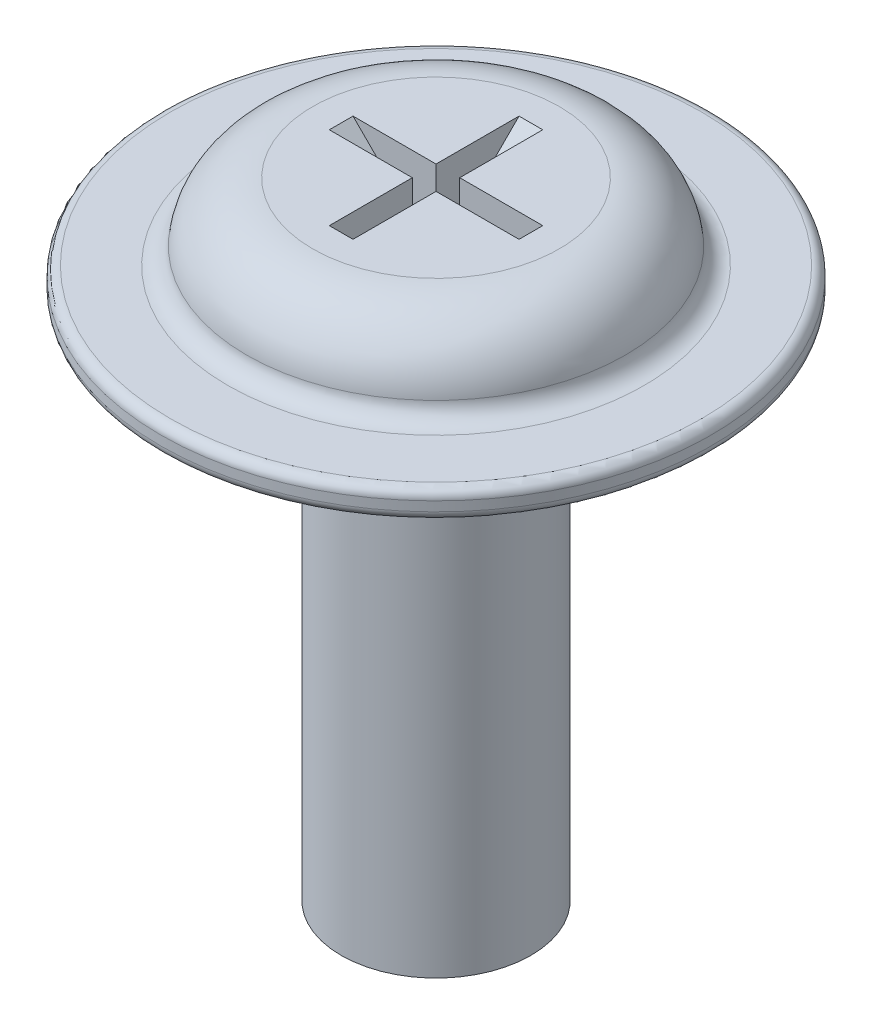
ISO-10303-21;
HEADER;
FILE_DESCRIPTION(('STEP AP214'),'2;1');
FILE_NAME('part.step','',(''),(''),'','','');
FILE_SCHEMA(('AUTOMOTIVE_DESIGN { 1 0 10303 214 1 1 1 1 }'));
ENDSEC;
DATA;
#1=APPLICATION_CONTEXT('core data for automotive mechanical design processes');
#2=APPLICATION_PROTOCOL_DEFINITION('international standard','automotive_design',2000,#1);
#3=PRODUCT_CONTEXT('',#1,'mechanical');
#4=PRODUCT('Part','Part','',(#3));
#5=PRODUCT_RELATED_PRODUCT_CATEGORY('part','',(#4));
#6=PRODUCT_DEFINITION_FORMATION('','',#4);
#7=PRODUCT_DEFINITION_CONTEXT('part definition',#1,'design');
#8=PRODUCT_DEFINITION('design','',#6,#7);
#9=PRODUCT_DEFINITION_SHAPE('','',#8);
#10=(LENGTH_UNIT() NAMED_UNIT(*) SI_UNIT(.MILLI.,.METRE.));
#11=(NAMED_UNIT(*) PLANE_ANGLE_UNIT() SI_UNIT($,.RADIAN.));
#12=(NAMED_UNIT(*) SI_UNIT($,.STERADIAN.) SOLID_ANGLE_UNIT());
#13=UNCERTAINTY_MEASURE_WITH_UNIT(LENGTH_MEASURE(1.E-05),#10,'distance_accuracy_value','');
#14=(GEOMETRIC_REPRESENTATION_CONTEXT(3) GLOBAL_UNCERTAINTY_ASSIGNED_CONTEXT((#13)) GLOBAL_UNIT_ASSIGNED_CONTEXT((#10,
#11,#12)) REPRESENTATION_CONTEXT('',''));
#15=CARTESIAN_POINT('',(0.,0.,0.));
#16=DIRECTION('',(0.,0.,1.));
#17=DIRECTION('',(1.,0.,0.));
#18=AXIS2_PLACEMENT_3D('',#15,#16,#17);
#19=CARTESIAN_POINT('',(0.,0.3,0.));
#20=DIRECTION('',(0.,-1.,0.));
#21=DIRECTION('',(0.,0.,-1.));
#22=AXIS2_PLACEMENT_3D('',#19,#20,#21);
#23=CYLINDRICAL_SURFACE('',#22,2.9);
#24=CARTESIAN_POINT('',(0.,0.1,0.));
#25=DIRECTION('',(0.,1.,0.));
#26=DIRECTION('',(0.,0.,1.));
#27=AXIS2_PLACEMENT_3D('',#24,#25,#26);
#28=CIRCLE('',#27,2.9);
#29=CARTESIAN_POINT('',(0.,0.1,2.9));
#30=VERTEX_POINT('',#29);
#31=EDGE_CURVE('E296',#30,#30,#28,.T.);
#32=ORIENTED_EDGE('',*,*,#31,.T.);
#33=EDGE_LOOP('',(#32));
#34=FACE_BOUND('',#33,.T.);
#35=CARTESIAN_POINT('',(0.,0.2,0.));
#36=DIRECTION('',(0.,1.,0.));
#37=DIRECTION('',(0.,0.,1.));
#38=AXIS2_PLACEMENT_3D('',#35,#36,#37);
#39=CIRCLE('',#38,2.9);
#40=CARTESIAN_POINT('',(0.,0.2,2.9));
#41=VERTEX_POINT('',#40);
#42=EDGE_CURVE('E251',#41,#41,#39,.F.);
#43=ORIENTED_EDGE('',*,*,#42,.T.);
#44=EDGE_LOOP('',(#43));
#45=FACE_BOUND('',#44,.T.);
#46=ADVANCED_FACE('F50',(#34,#45),#23,.T.);
#47=CARTESIAN_POINT('',(0.,0.3,0.));
#48=DIRECTION('',(0.,1.,0.));
#49=DIRECTION('',(0.,0.,1.));
#50=AXIS2_PLACEMENT_3D('',#47,#48,#49);
#51=PLANE('',#50);
#52=CARTESIAN_POINT('',(0.,0.3,0.));
#53=DIRECTION('',(0.,1.,0.));
#54=DIRECTION('',(0.,0.,1.));
#55=AXIS2_PLACEMENT_3D('',#52,#53,#54);
#56=CIRCLE('',#55,2.19442719099992);
#57=CARTESIAN_POINT('',(0.,0.3,2.19442719099992));
#58=VERTEX_POINT('',#57);
#59=EDGE_CURVE('E297',#58,#58,#56,.F.);
#60=ORIENTED_EDGE('',*,*,#59,.T.);
#61=EDGE_LOOP('',(#60));
#62=FACE_BOUND('',#61,.T.);
#63=CARTESIAN_POINT('',(0.,0.3,0.));
#64=DIRECTION('',(0.,1.,0.));
#65=DIRECTION('',(0.,0.,1.));
#66=AXIS2_PLACEMENT_3D('',#63,#64,#65);
#67=CIRCLE('',#66,2.8);
#68=CARTESIAN_POINT('',(0.,0.3,2.8));
#69=VERTEX_POINT('',#68);
#70=EDGE_CURVE('E248',#69,#69,#67,.T.);
#71=ORIENTED_EDGE('',*,*,#70,.T.);
#72=EDGE_LOOP('',(#71));
#73=FACE_BOUND('',#72,.T.);
#74=ADVANCED_FACE('F324',(#62,#73),#51,.T.);
#75=CARTESIAN_POINT('',(0.,0.,0.));
#76=DIRECTION('',(0.,1.,0.));
#77=DIRECTION('',(0.,0.,1.));
#78=AXIS2_PLACEMENT_3D('',#75,#76,#77);
#79=PLANE('',#78);
#80=CARTESIAN_POINT('',(0.,0.,0.));
#81=DIRECTION('',(0.,1.,0.));
#82=DIRECTION('',(0.,0.,1.));
#83=AXIS2_PLACEMENT_3D('',#80,#81,#82);
#84=CIRCLE('',#83,1.1);
#85=CARTESIAN_POINT('',(0.,0.,1.1));
#86=VERTEX_POINT('',#85);
#87=EDGE_CURVE('E11',#86,#86,#84,.T.);
#88=ORIENTED_EDGE('',*,*,#87,.T.);
#89=EDGE_LOOP('',(#88));
#90=FACE_BOUND('',#89,.T.);
#91=CARTESIAN_POINT('',(0.,0.,0.));
#92=DIRECTION('',(0.,1.,0.));
#93=DIRECTION('',(0.,0.,1.));
#94=AXIS2_PLACEMENT_3D('',#91,#92,#93);
#95=CIRCLE('',#94,2.8);
#96=CARTESIAN_POINT('',(0.,0.,2.8));
#97=VERTEX_POINT('',#96);
#98=EDGE_CURVE('E303',#97,#97,#95,.F.);
#99=ORIENTED_EDGE('',*,*,#98,.T.);
#100=EDGE_LOOP('',(#99));
#101=FACE_BOUND('',#100,.T.);
#102=ADVANCED_FACE('F335',(#90,#101),#79,.F.);
#103=CARTESIAN_POINT('',(0.,0.2,0.));
#104=DIRECTION('',(0.,1.,0.));
#105=DIRECTION('',(0.,0.,1.));
#106=AXIS2_PLACEMENT_3D('',#103,#104,#105);
#107=TOROIDAL_SURFACE('',#106,2.8,0.1);
#108=ORIENTED_EDGE('',*,*,#42,.F.);
#109=EDGE_LOOP('',(#108));
#110=FACE_BOUND('',#109,.T.);
#111=ORIENTED_EDGE('',*,*,#70,.F.);
#112=EDGE_LOOP('',(#111));
#113=FACE_BOUND('',#112,.T.);
#114=ADVANCED_FACE('F338',(#110,#113),#107,.T.);
#115=CARTESIAN_POINT('',(0.,0.400000000000001,0.));
#116=DIRECTION('',(0.,1.,0.));
#117=DIRECTION('',(0.,0.,1.));
#118=AXIS2_PLACEMENT_3D('',#115,#116,#117);
#119=TOROIDAL_SURFACE('',#118,1.3,0.7);
#120=CARTESIAN_POINT('',(0.,0.477777777777778,0.));
#121=DIRECTION('',(0.,-1.,0.));
#122=DIRECTION('',(0.,0.,-1.));
#123=AXIS2_PLACEMENT_3D('',#120,#121,#122);
#124=CIRCLE('',#123,1.99566559299994);
#125=CARTESIAN_POINT('',(0.,0.477777777777778,-1.99566559299994));
#126=VERTEX_POINT('',#125);
#127=EDGE_CURVE('E295',#126,#126,#124,.F.);
#128=ORIENTED_EDGE('',*,*,#127,.T.);
#129=EDGE_LOOP('',(#128));
#130=FACE_BOUND('',#129,.T.);
#131=CARTESIAN_POINT('',(0.,1.1,0.));
#132=DIRECTION('',(0.,1.,0.));
#133=DIRECTION('',(0.,0.,1.));
#134=AXIS2_PLACEMENT_3D('',#131,#132,#133);
#135=CIRCLE('',#134,1.3);
#136=CARTESIAN_POINT('',(0.,1.1,1.3));
#137=VERTEX_POINT('',#136);
#138=EDGE_CURVE('E241',#137,#137,#135,.T.);
#139=ORIENTED_EDGE('',*,*,#138,.F.);
#140=EDGE_LOOP('',(#139));
#141=FACE_BOUND('',#140,.T.);
#142=ADVANCED_FACE('F341',(#130,#141),#119,.T.);
#143=CARTESIAN_POINT('',(0.,1.1,0.));
#144=DIRECTION('',(0.,-1.,0.));
#145=DIRECTION('',(0.,0.,-1.));
#146=AXIS2_PLACEMENT_3D('',#143,#144,#145);
#147=PLANE('',#146);
#148=DIRECTION('',(1.,0.,0.));
#149=VECTOR('',#148,1.);
#150=CARTESIAN_POINT('',(-0.125,1.1,0.125));
#151=LINE('',#150,#149);
#152=CARTESIAN_POINT('',(-1.,1.1,0.125));
#153=VERTEX_POINT('',#152);
#154=CARTESIAN_POINT('',(-0.125,1.1,0.125));
#155=VERTEX_POINT('',#154);
#156=EDGE_CURVE('E63',#153,#155,#151,.T.);
#157=ORIENTED_EDGE('',*,*,#156,.F.);
#158=DIRECTION('',(0.,0.,-1.));
#159=VECTOR('',#158,1.);
#160=CARTESIAN_POINT('',(-1.,1.1,0.));
#161=LINE('',#160,#159);
#162=CARTESIAN_POINT('',(-1.,1.1,-0.125));
#163=VERTEX_POINT('',#162);
#164=EDGE_CURVE('E268',#153,#163,#161,.T.);
#165=ORIENTED_EDGE('',*,*,#164,.T.);
#166=DIRECTION('',(-1.,0.,0.));
#167=VECTOR('',#166,1.);
#168=CARTESIAN_POINT('',(-0.125,1.1,-0.125));
#169=LINE('',#168,#167);
#170=CARTESIAN_POINT('',(-0.125,1.1,-0.125));
#171=VERTEX_POINT('',#170);
#172=EDGE_CURVE('E72',#171,#163,#169,.T.);
#173=ORIENTED_EDGE('',*,*,#172,.F.);
#174=DIRECTION('',(0.,0.,1.));
#175=VECTOR('',#174,1.);
#176=CARTESIAN_POINT('',(-0.125,1.1,-0.5));
#177=LINE('',#176,#175);
#178=CARTESIAN_POINT('',(-0.125,1.1,-1.));
#179=VERTEX_POINT('',#178);
#180=EDGE_CURVE('E216',#179,#171,#177,.T.);
#181=ORIENTED_EDGE('',*,*,#180,.F.);
#182=DIRECTION('',(1.,0.,0.));
#183=VECTOR('',#182,1.);
#184=CARTESIAN_POINT('',(0.,1.1,-1.));
#185=LINE('',#184,#183);
#186=CARTESIAN_POINT('',(0.125,1.1,-1.));
#187=VERTEX_POINT('',#186);
#188=EDGE_CURVE('E260',#179,#187,#185,.T.);
#189=ORIENTED_EDGE('',*,*,#188,.T.);
#190=DIRECTION('',(0.,0.,-1.));
#191=VECTOR('',#190,1.);
#192=CARTESIAN_POINT('',(0.125,1.1,-0.5));
#193=LINE('',#192,#191);
#194=CARTESIAN_POINT('',(0.125,1.1,-0.125));
#195=VERTEX_POINT('',#194);
#196=EDGE_CURVE('E213',#195,#187,#193,.T.);
#197=ORIENTED_EDGE('',*,*,#196,.F.);
#198=DIRECTION('',(-1.,0.,0.));
#199=VECTOR('',#198,1.);
#200=CARTESIAN_POINT('',(0.125,1.1,-0.125));
#201=LINE('',#200,#199);
#202=CARTESIAN_POINT('',(1.,1.1,-0.125));
#203=VERTEX_POINT('',#202);
#204=EDGE_CURVE('E207',#203,#195,#201,.T.);
#205=ORIENTED_EDGE('',*,*,#204,.F.);
#206=DIRECTION('',(0.,0.,1.));
#207=VECTOR('',#206,1.);
#208=CARTESIAN_POINT('',(1.,1.1,0.));
#209=LINE('',#208,#207);
#210=CARTESIAN_POINT('',(1.,1.1,0.125));
#211=VERTEX_POINT('',#210);
#212=EDGE_CURVE('E261',#203,#211,#209,.T.);
#213=ORIENTED_EDGE('',*,*,#212,.T.);
#214=DIRECTION('',(1.,0.,0.));
#215=VECTOR('',#214,1.);
#216=CARTESIAN_POINT('',(0.125,1.1,0.125));
#217=LINE('',#216,#215);
#218=CARTESIAN_POINT('',(0.125,1.1,0.125));
#219=VERTEX_POINT('',#218);
#220=EDGE_CURVE('E145',#219,#211,#217,.T.);
#221=ORIENTED_EDGE('',*,*,#220,.F.);
#222=DIRECTION('',(0.,0.,-1.));
#223=VECTOR('',#222,1.);
#224=CARTESIAN_POINT('',(0.125,1.1,0.5));
#225=LINE('',#224,#223);
#226=CARTESIAN_POINT('',(0.125,1.1,1.));
#227=VERTEX_POINT('',#226);
#228=EDGE_CURVE('E165',#227,#219,#225,.T.);
#229=ORIENTED_EDGE('',*,*,#228,.F.);
#230=DIRECTION('',(-1.,0.,0.));
#231=VECTOR('',#230,1.);
#232=CARTESIAN_POINT('',(0.,1.1,1.));
#233=LINE('',#232,#231);
#234=CARTESIAN_POINT('',(-0.125,1.1,1.));
#235=VERTEX_POINT('',#234);
#236=EDGE_CURVE('E262',#227,#235,#233,.T.);
#237=ORIENTED_EDGE('',*,*,#236,.T.);
#238=DIRECTION('',(0.,0.,1.));
#239=VECTOR('',#238,1.);
#240=CARTESIAN_POINT('',(-0.125,1.1,0.5));
#241=LINE('',#240,#239);
#242=EDGE_CURVE('E221',#155,#235,#241,.T.);
#243=ORIENTED_EDGE('',*,*,#242,.F.);
#244=EDGE_LOOP('',(#157,#165,#173,#181,#189,#197,#205,#213,#221,#229,#237,#243));
#245=FACE_BOUND('',#244,.T.);
#246=ORIENTED_EDGE('',*,*,#138,.T.);
#247=EDGE_LOOP('',(#246));
#248=FACE_BOUND('',#247,.T.);
#249=ADVANCED_FACE('F378',(#245,#248),#147,.F.);
#250=CARTESIAN_POINT('',(0.,-5.5,0.));
#251=DIRECTION('',(0.,1.,0.));
#252=DIRECTION('',(0.,0.,1.));
#253=AXIS2_PLACEMENT_3D('',#250,#251,#252);
#254=CYLINDRICAL_SURFACE('',#253,1.);
#255=CARTESIAN_POINT('',(0.,-0.1,0.));
#256=DIRECTION('',(0.,1.,0.));
#257=DIRECTION('',(0.,0.,1.));
#258=AXIS2_PLACEMENT_3D('',#255,#256,#257);
#259=CIRCLE('',#258,1.);
#260=CARTESIAN_POINT('',(0.,-0.1,1.));
#261=VERTEX_POINT('',#260);
#262=EDGE_CURVE('E57',#261,#261,#259,.F.);
#263=ORIENTED_EDGE('',*,*,#262,.T.);
#264=EDGE_LOOP('',(#263));
#265=FACE_BOUND('',#264,.T.);
#266=CARTESIAN_POINT('',(0.,-5.5,0.));
#267=DIRECTION('',(0.,-1.,0.));
#268=DIRECTION('',(0.,0.,-1.));
#269=AXIS2_PLACEMENT_3D('',#266,#267,#268);
#270=CIRCLE('',#269,1.);
#271=CARTESIAN_POINT('',(0.,-5.5,-1.));
#272=VERTEX_POINT('',#271);
#273=EDGE_CURVE('E232',#272,#272,#270,.T.);
#274=ORIENTED_EDGE('',*,*,#273,.F.);
#275=EDGE_LOOP('',(#274));
#276=FACE_BOUND('',#275,.T.);
#277=ADVANCED_FACE('F313',(#265,#276),#254,.T.);
#278=CARTESIAN_POINT('',(0.,-5.5,0.));
#279=DIRECTION('',(0.,-1.,0.));
#280=DIRECTION('',(0.,0.,-1.));
#281=AXIS2_PLACEMENT_3D('',#278,#279,#280);
#282=PLANE('',#281);
#283=ORIENTED_EDGE('',*,*,#273,.T.);
#284=EDGE_LOOP('',(#283));
#285=FACE_BOUND('',#284,.T.);
#286=ADVANCED_FACE('F389',(#285),#282,.T.);
#287=CARTESIAN_POINT('',(0.125,0.6,0.125));
#288=DIRECTION('',(0.,0.,1.));
#289=DIRECTION('',(1.,0.,0.));
#290=AXIS2_PLACEMENT_3D('',#287,#288,#289);
#291=PLANE('',#290);
#292=ORIENTED_EDGE('',*,*,#220,.T.);
#293=DIRECTION('',(0.707106781186549,0.707106781186546,0.));
#294=VECTOR('',#293,1.);
#295=CARTESIAN_POINT('',(0.312499999999999,0.412500000000001,0.125));
#296=LINE('',#295,#294);
#297=CARTESIAN_POINT('',(0.5,0.6,0.125));
#298=VERTEX_POINT('',#297);
#299=EDGE_CURVE('E137',#211,#298,#296,.F.);
#300=ORIENTED_EDGE('',*,*,#299,.T.);
#301=DIRECTION('',(1.,0.,0.));
#302=VECTOR('',#301,1.);
#303=CARTESIAN_POINT('',(0.125,0.6,0.125));
#304=LINE('',#303,#302);
#305=CARTESIAN_POINT('',(0.125,0.6,0.125));
#306=VERTEX_POINT('',#305);
#307=EDGE_CURVE('E143',#306,#298,#304,.T.);
#308=ORIENTED_EDGE('',*,*,#307,.F.);
#309=DIRECTION('',(0.,1.,0.));
#310=VECTOR('',#309,1.);
#311=CARTESIAN_POINT('',(0.125,0.6,0.125));
#312=LINE('',#311,#310);
#313=EDGE_CURVE('E226',#306,#219,#312,.T.);
#314=ORIENTED_EDGE('',*,*,#313,.T.);
#315=EDGE_LOOP('',(#292,#300,#308,#314));
#316=FACE_BOUND('',#315,.T.);
#317=ADVANCED_FACE('F139',(#316),#291,.F.);
#318=CARTESIAN_POINT('',(0.125,0.6,0.5));
#319=DIRECTION('',(1.,0.,0.));
#320=DIRECTION('',(0.,0.,-1.));
#321=AXIS2_PLACEMENT_3D('',#318,#319,#320);
#322=PLANE('',#321);
#323=ORIENTED_EDGE('',*,*,#228,.T.);
#324=ORIENTED_EDGE('',*,*,#313,.F.);
#325=DIRECTION('',(0.,0.,-1.));
#326=VECTOR('',#325,1.);
#327=CARTESIAN_POINT('',(0.125,0.6,0.5));
#328=LINE('',#327,#326);
#329=CARTESIAN_POINT('',(0.125,0.6,0.5));
#330=VERTEX_POINT('',#329);
#331=EDGE_CURVE('E159',#330,#306,#328,.T.);
#332=ORIENTED_EDGE('',*,*,#331,.F.);
#333=DIRECTION('',(0.,-0.707106781186546,-0.707106781186549));
#334=VECTOR('',#333,1.);
#335=CARTESIAN_POINT('',(0.125,0.600000000000001,0.5));
#336=LINE('',#335,#334);
#337=EDGE_CURVE('E280',#330,#227,#336,.F.);
#338=ORIENTED_EDGE('',*,*,#337,.T.);
#339=EDGE_LOOP('',(#323,#324,#332,#338));
#340=FACE_BOUND('',#339,.T.);
#341=ADVANCED_FACE('F394',(#340),#322,.F.);
#342=CARTESIAN_POINT('',(-0.125,0.6,0.5));
#343=DIRECTION('',(-1.,0.,0.));
#344=DIRECTION('',(0.,0.,1.));
#345=AXIS2_PLACEMENT_3D('',#342,#343,#344);
#346=PLANE('',#345);
#347=ORIENTED_EDGE('',*,*,#242,.T.);
#348=DIRECTION('',(0.,0.707106781186546,0.707106781186549));
#349=VECTOR('',#348,1.);
#350=CARTESIAN_POINT('',(-0.125,0.600000000000001,0.5));
#351=LINE('',#350,#349);
#352=CARTESIAN_POINT('',(-0.125,0.6,0.5));
#353=VERTEX_POINT('',#352);
#354=EDGE_CURVE('E282',#235,#353,#351,.F.);
#355=ORIENTED_EDGE('',*,*,#354,.T.);
#356=DIRECTION('',(0.,0.,1.));
#357=VECTOR('',#356,1.);
#358=CARTESIAN_POINT('',(-0.125,0.6,0.5));
#359=LINE('',#358,#357);
#360=CARTESIAN_POINT('',(-0.125,0.6,0.125));
#361=VERTEX_POINT('',#360);
#362=EDGE_CURVE('E197',#361,#353,#359,.T.);
#363=ORIENTED_EDGE('',*,*,#362,.F.);
#364=DIRECTION('',(0.,1.,0.));
#365=VECTOR('',#364,1.);
#366=CARTESIAN_POINT('',(-0.125,0.6,0.125));
#367=LINE('',#366,#365);
#368=EDGE_CURVE('E233',#361,#155,#367,.T.);
#369=ORIENTED_EDGE('',*,*,#368,.T.);
#370=EDGE_LOOP('',(#347,#355,#363,#369));
#371=FACE_BOUND('',#370,.T.);
#372=ADVANCED_FACE('F412',(#371),#346,.F.);
#373=CARTESIAN_POINT('',(-0.125,0.6,0.125));
#374=DIRECTION('',(0.,0.,1.));
#375=DIRECTION('',(1.,0.,0.));
#376=AXIS2_PLACEMENT_3D('',#373,#374,#375);
#377=PLANE('',#376);
#378=ORIENTED_EDGE('',*,*,#156,.T.);
#379=ORIENTED_EDGE('',*,*,#368,.F.);
#380=DIRECTION('',(1.,0.,0.));
#381=VECTOR('',#380,1.);
#382=CARTESIAN_POINT('',(-0.125,0.6,0.125));
#383=LINE('',#382,#381);
#384=CARTESIAN_POINT('',(-0.5,0.6,0.125));
#385=VERTEX_POINT('',#384);
#386=EDGE_CURVE('E192',#385,#361,#383,.T.);
#387=ORIENTED_EDGE('',*,*,#386,.F.);
#388=DIRECTION('',(0.707106781186549,-0.707106781186546,0.));
#389=VECTOR('',#388,1.);
#390=CARTESIAN_POINT('',(-0.312499999999999,0.412500000000001,0.125));
#391=LINE('',#390,#389);
#392=EDGE_CURVE('E271',#385,#153,#391,.F.);
#393=ORIENTED_EDGE('',*,*,#392,.T.);
#394=EDGE_LOOP('',(#378,#379,#387,#393));
#395=FACE_BOUND('',#394,.T.);
#396=ADVANCED_FACE('F406',(#395),#377,.F.);
#397=CARTESIAN_POINT('',(-0.125,0.6,-0.125));
#398=DIRECTION('',(0.,0.,-1.));
#399=DIRECTION('',(-1.,0.,0.));
#400=AXIS2_PLACEMENT_3D('',#397,#398,#399);
#401=PLANE('',#400);
#402=ORIENTED_EDGE('',*,*,#172,.T.);
#403=DIRECTION('',(-0.707106781186549,0.707106781186546,0.));
#404=VECTOR('',#403,1.);
#405=CARTESIAN_POINT('',(-0.312499999999999,0.412500000000001,-0.125));
#406=LINE('',#405,#404);
#407=CARTESIAN_POINT('',(-0.5,0.6,-0.125));
#408=VERTEX_POINT('',#407);
#409=EDGE_CURVE('E273',#163,#408,#406,.F.);
#410=ORIENTED_EDGE('',*,*,#409,.T.);
#411=DIRECTION('',(-1.,0.,0.));
#412=VECTOR('',#411,1.);
#413=CARTESIAN_POINT('',(-0.125,0.6,-0.125));
#414=LINE('',#413,#412);
#415=CARTESIAN_POINT('',(-0.125,0.6,-0.125));
#416=VERTEX_POINT('',#415);
#417=EDGE_CURVE('E183',#416,#408,#414,.T.);
#418=ORIENTED_EDGE('',*,*,#417,.F.);
#419=DIRECTION('',(0.,1.,0.));
#420=VECTOR('',#419,1.);
#421=CARTESIAN_POINT('',(-0.125,0.6,-0.125));
#422=LINE('',#421,#420);
#423=EDGE_CURVE('E240',#416,#171,#422,.T.);
#424=ORIENTED_EDGE('',*,*,#423,.T.);
#425=EDGE_LOOP('',(#402,#410,#418,#424));
#426=FACE_BOUND('',#425,.T.);
#427=ADVANCED_FACE('F407',(#426),#401,.F.);
#428=CARTESIAN_POINT('',(-0.125,0.6,-0.5));
#429=DIRECTION('',(-1.,0.,0.));
#430=DIRECTION('',(0.,0.,1.));
#431=AXIS2_PLACEMENT_3D('',#428,#429,#430);
#432=PLANE('',#431);
#433=ORIENTED_EDGE('',*,*,#180,.T.);
#434=ORIENTED_EDGE('',*,*,#423,.F.);
#435=DIRECTION('',(0.,0.,1.));
#436=VECTOR('',#435,1.);
#437=CARTESIAN_POINT('',(-0.125,0.6,-0.5));
#438=LINE('',#437,#436);
#439=CARTESIAN_POINT('',(-0.125,0.6,-0.5));
#440=VERTEX_POINT('',#439);
#441=EDGE_CURVE('E182',#440,#416,#438,.T.);
#442=ORIENTED_EDGE('',*,*,#441,.F.);
#443=DIRECTION('',(0.,-0.707106781186546,0.707106781186549));
#444=VECTOR('',#443,1.);
#445=CARTESIAN_POINT('',(-0.125,0.600000000000001,-0.5));
#446=LINE('',#445,#444);
#447=EDGE_CURVE('E147',#440,#179,#446,.F.);
#448=ORIENTED_EDGE('',*,*,#447,.T.);
#449=EDGE_LOOP('',(#433,#434,#442,#448));
#450=FACE_BOUND('',#449,.T.);
#451=ADVANCED_FACE('F405',(#450),#432,.F.);
#452=CARTESIAN_POINT('',(0.125,0.6,-0.5));
#453=DIRECTION('',(1.,0.,0.));
#454=DIRECTION('',(0.,0.,-1.));
#455=AXIS2_PLACEMENT_3D('',#452,#453,#454);
#456=PLANE('',#455);
#457=ORIENTED_EDGE('',*,*,#196,.T.);
#458=DIRECTION('',(0.,0.707106781186546,-0.707106781186549));
#459=VECTOR('',#458,1.);
#460=CARTESIAN_POINT('',(0.125,0.600000000000001,-0.5));
#461=LINE('',#460,#459);
#462=CARTESIAN_POINT('',(0.125,0.6,-0.5));
#463=VERTEX_POINT('',#462);
#464=EDGE_CURVE('E288',#187,#463,#461,.F.);
#465=ORIENTED_EDGE('',*,*,#464,.T.);
#466=DIRECTION('',(0.,0.,-1.));
#467=VECTOR('',#466,1.);
#468=CARTESIAN_POINT('',(0.125,0.6,-0.5));
#469=LINE('',#468,#467);
#470=CARTESIAN_POINT('',(0.125,0.6,-0.125));
#471=VERTEX_POINT('',#470);
#472=EDGE_CURVE('E172',#471,#463,#469,.T.);
#473=ORIENTED_EDGE('',*,*,#472,.F.);
#474=DIRECTION('',(0.,1.,0.));
#475=VECTOR('',#474,1.);
#476=CARTESIAN_POINT('',(0.125,0.6,-0.125));
#477=LINE('',#476,#475);
#478=EDGE_CURVE('E206',#471,#195,#477,.T.);
#479=ORIENTED_EDGE('',*,*,#478,.T.);
#480=EDGE_LOOP('',(#457,#465,#473,#479));
#481=FACE_BOUND('',#480,.T.);
#482=ADVANCED_FACE('F397',(#481),#456,.F.);
#483=CARTESIAN_POINT('',(0.125,0.6,-0.125));
#484=DIRECTION('',(0.,0.,-1.));
#485=DIRECTION('',(-1.,0.,0.));
#486=AXIS2_PLACEMENT_3D('',#483,#484,#485);
#487=PLANE('',#486);
#488=ORIENTED_EDGE('',*,*,#204,.T.);
#489=ORIENTED_EDGE('',*,*,#478,.F.);
#490=DIRECTION('',(-1.,0.,0.));
#491=VECTOR('',#490,1.);
#492=CARTESIAN_POINT('',(0.125,0.6,-0.125));
#493=LINE('',#492,#491);
#494=CARTESIAN_POINT('',(0.5,0.6,-0.125));
#495=VERTEX_POINT('',#494);
#496=EDGE_CURVE('E169',#495,#471,#493,.T.);
#497=ORIENTED_EDGE('',*,*,#496,.F.);
#498=DIRECTION('',(-0.707106781186549,-0.707106781186546,0.));
#499=VECTOR('',#498,1.);
#500=CARTESIAN_POINT('',(0.312499999999999,0.412500000000001,-0.125));
#501=LINE('',#500,#499);
#502=EDGE_CURVE('E151',#495,#203,#501,.F.);
#503=ORIENTED_EDGE('',*,*,#502,.T.);
#504=EDGE_LOOP('',(#488,#489,#497,#503));
#505=FACE_BOUND('',#504,.T.);
#506=ADVANCED_FACE('F391',(#505),#487,.F.);
#507=CARTESIAN_POINT('',(0.,0.6,0.));
#508=DIRECTION('',(0.,-1.,0.));
#509=DIRECTION('',(0.,0.,-1.));
#510=AXIS2_PLACEMENT_3D('',#507,#508,#509);
#511=PLANE('',#510);
#512=ORIENTED_EDGE('',*,*,#307,.T.);
#513=DIRECTION('',(0.,0.,-1.));
#514=VECTOR('',#513,1.);
#515=CARTESIAN_POINT('',(0.5,0.6,-0.125));
#516=LINE('',#515,#514);
#517=EDGE_CURVE('E160',#298,#495,#516,.T.);
#518=ORIENTED_EDGE('',*,*,#517,.T.);
#519=ORIENTED_EDGE('',*,*,#496,.T.);
#520=ORIENTED_EDGE('',*,*,#472,.T.);
#521=DIRECTION('',(-1.,0.,0.));
#522=VECTOR('',#521,1.);
#523=CARTESIAN_POINT('',(-0.125,0.6,-0.5));
#524=LINE('',#523,#522);
#525=EDGE_CURVE('E180',#463,#440,#524,.T.);
#526=ORIENTED_EDGE('',*,*,#525,.T.);
#527=ORIENTED_EDGE('',*,*,#441,.T.);
#528=ORIENTED_EDGE('',*,*,#417,.T.);
#529=DIRECTION('',(0.,0.,1.));
#530=VECTOR('',#529,1.);
#531=CARTESIAN_POINT('',(-0.5,0.6,-0.125));
#532=LINE('',#531,#530);
#533=EDGE_CURVE('E189',#408,#385,#532,.T.);
#534=ORIENTED_EDGE('',*,*,#533,.T.);
#535=ORIENTED_EDGE('',*,*,#386,.T.);
#536=ORIENTED_EDGE('',*,*,#362,.T.);
#537=DIRECTION('',(1.,0.,0.));
#538=VECTOR('',#537,1.);
#539=CARTESIAN_POINT('',(-0.125,0.6,0.5));
#540=LINE('',#539,#538);
#541=EDGE_CURVE('E203',#353,#330,#540,.T.);
#542=ORIENTED_EDGE('',*,*,#541,.T.);
#543=ORIENTED_EDGE('',*,*,#331,.T.);
#544=EDGE_LOOP('',(#512,#518,#519,#520,#526,#527,#528,#534,#535,#536,#542,#543));
#545=FACE_BOUND('',#544,.T.);
#546=ADVANCED_FACE('F154',(#545),#511,.F.);
#547=CARTESIAN_POINT('',(-0.5,0.600000000000001,-0.125));
#548=DIRECTION('',(-0.707106781186546,-0.707106781186549,0.));
#549=DIRECTION('',(0.,0.,1.));
#550=AXIS2_PLACEMENT_3D('',#547,#548,#549);
#551=PLANE('',#550);
#552=ORIENTED_EDGE('',*,*,#409,.F.);
#553=ORIENTED_EDGE('',*,*,#164,.F.);
#554=ORIENTED_EDGE('',*,*,#392,.F.);
#555=ORIENTED_EDGE('',*,*,#533,.F.);
#556=EDGE_LOOP('',(#552,#553,#554,#555));
#557=FACE_BOUND('',#556,.T.);
#558=ADVANCED_FACE('F343',(#557),#551,.F.);
#559=CARTESIAN_POINT('',(-0.125,0.600000000000001,0.5));
#560=DIRECTION('',(0.,-0.707106781186549,0.707106781186546));
#561=DIRECTION('',(1.,0.,0.));
#562=AXIS2_PLACEMENT_3D('',#559,#560,#561);
#563=PLANE('',#562);
#564=ORIENTED_EDGE('',*,*,#354,.F.);
#565=ORIENTED_EDGE('',*,*,#236,.F.);
#566=ORIENTED_EDGE('',*,*,#337,.F.);
#567=ORIENTED_EDGE('',*,*,#541,.F.);
#568=EDGE_LOOP('',(#564,#565,#566,#567));
#569=FACE_BOUND('',#568,.T.);
#570=ADVANCED_FACE('F348',(#569),#563,.F.);
#571=CARTESIAN_POINT('',(0.5,0.600000000000001,-0.125));
#572=DIRECTION('',(0.707106781186546,-0.707106781186549,0.));
#573=DIRECTION('',(0.,0.,-1.));
#574=AXIS2_PLACEMENT_3D('',#571,#572,#573);
#575=PLANE('',#574);
#576=ORIENTED_EDGE('',*,*,#299,.F.);
#577=ORIENTED_EDGE('',*,*,#212,.F.);
#578=ORIENTED_EDGE('',*,*,#502,.F.);
#579=ORIENTED_EDGE('',*,*,#517,.F.);
#580=EDGE_LOOP('',(#576,#577,#578,#579));
#581=FACE_BOUND('',#580,.T.);
#582=ADVANCED_FACE('F163',(#581),#575,.F.);
#583=CARTESIAN_POINT('',(-0.125,0.600000000000001,-0.5));
#584=DIRECTION('',(0.,-0.707106781186549,-0.707106781186546));
#585=DIRECTION('',(-1.,0.,0.));
#586=AXIS2_PLACEMENT_3D('',#583,#584,#585);
#587=PLANE('',#586);
#588=ORIENTED_EDGE('',*,*,#464,.F.);
#589=ORIENTED_EDGE('',*,*,#188,.F.);
#590=ORIENTED_EDGE('',*,*,#447,.F.);
#591=ORIENTED_EDGE('',*,*,#525,.F.);
#592=EDGE_LOOP('',(#588,#589,#590,#591));
#593=FACE_BOUND('',#592,.T.);
#594=ADVANCED_FACE('F361',(#593),#587,.F.);
#595=CARTESIAN_POINT('',(0.,0.5,0.));
#596=DIRECTION('',(0.,1.,0.));
#597=DIRECTION('',(0.,0.,1.));
#598=AXIS2_PLACEMENT_3D('',#595,#596,#597);
#599=TOROIDAL_SURFACE('',#598,2.19442719099992,0.2);
#600=ORIENTED_EDGE('',*,*,#59,.F.);
#601=EDGE_LOOP('',(#600));
#602=FACE_BOUND('',#601,.T.);
#603=ORIENTED_EDGE('',*,*,#127,.F.);
#604=EDGE_LOOP('',(#603));
#605=FACE_BOUND('',#604,.T.);
#606=ADVANCED_FACE('F321',(#602,#605),#599,.F.);
#607=CARTESIAN_POINT('',(0.,0.1,0.));
#608=DIRECTION('',(0.,1.,0.));
#609=DIRECTION('',(0.,0.,1.));
#610=AXIS2_PLACEMENT_3D('',#607,#608,#609);
#611=TOROIDAL_SURFACE('',#610,2.8,0.1);
#612=ORIENTED_EDGE('',*,*,#98,.F.);
#613=EDGE_LOOP('',(#612));
#614=FACE_BOUND('',#613,.T.);
#615=ORIENTED_EDGE('',*,*,#31,.F.);
#616=EDGE_LOOP('',(#615));
#617=FACE_BOUND('',#616,.T.);
#618=ADVANCED_FACE('F312',(#614,#617),#611,.T.);
#619=CARTESIAN_POINT('',(0.,-0.1,0.));
#620=DIRECTION('',(0.,1.,0.));
#621=DIRECTION('',(0.,0.,1.));
#622=AXIS2_PLACEMENT_3D('',#619,#620,#621);
#623=TOROIDAL_SURFACE('',#622,1.1,0.1);
#624=ORIENTED_EDGE('',*,*,#87,.F.);
#625=EDGE_LOOP('',(#624));
#626=FACE_BOUND('',#625,.T.);
#627=ORIENTED_EDGE('',*,*,#262,.F.);
#628=EDGE_LOOP('',(#627));
#629=FACE_BOUND('',#628,.T.);
#630=ADVANCED_FACE('F47',(#626,#629),#623,.F.);
#631=CLOSED_SHELL('',(#46,#74,#102,#114,#142,#249,#277,#286,#317,#341,#372,#396,#427,#451,#482,
#506,#546,#558,#570,#582,#594,#606,#618,#630));
#632=MANIFOLD_SOLID_BREP('B2',#631);
#633=ADVANCED_BREP_SHAPE_REPRESENTATION('',(#18,#632),#14);
#634=SHAPE_DEFINITION_REPRESENTATION(#9,#633);
ENDSEC;
END-ISO-10303-21;
